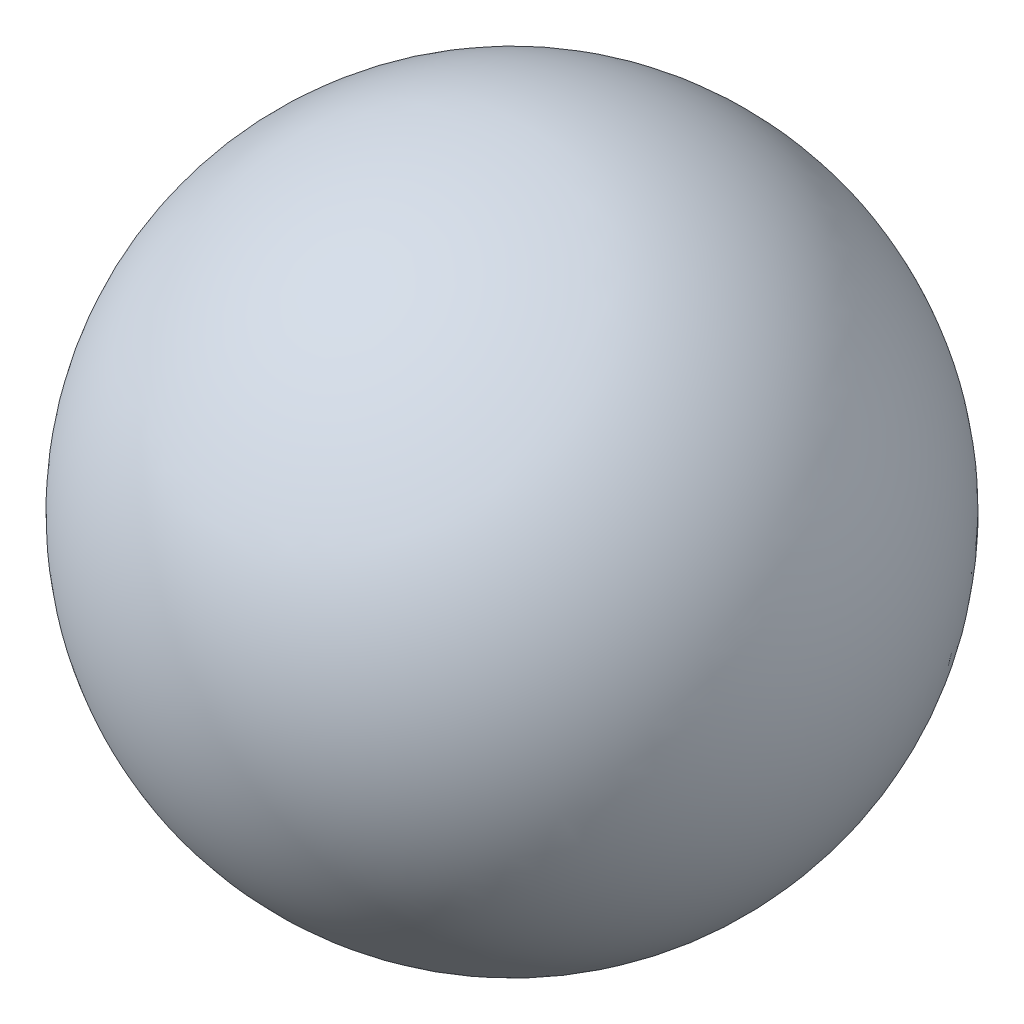
ISO-10303-21;
HEADER;
FILE_DESCRIPTION(('STEP AP214'),'2;1');
FILE_NAME('part.step','',(''),(''),'','','');
FILE_SCHEMA(('AUTOMOTIVE_DESIGN { 1 0 10303 214 1 1 1 1 }'));
ENDSEC;
DATA;
#1=APPLICATION_CONTEXT('core data for automotive mechanical design processes');
#2=APPLICATION_PROTOCOL_DEFINITION('international standard','automotive_design',2000,#1);
#3=PRODUCT_CONTEXT('',#1,'mechanical');
#4=PRODUCT('Part','Part','',(#3));
#5=PRODUCT_RELATED_PRODUCT_CATEGORY('part','',(#4));
#6=PRODUCT_DEFINITION_FORMATION('','',#4);
#7=PRODUCT_DEFINITION_CONTEXT('part definition',#1,'design');
#8=PRODUCT_DEFINITION('design','',#6,#7);
#9=PRODUCT_DEFINITION_SHAPE('','',#8);
#10=(LENGTH_UNIT() NAMED_UNIT(*) SI_UNIT(.MILLI.,.METRE.));
#11=(NAMED_UNIT(*) PLANE_ANGLE_UNIT() SI_UNIT($,.RADIAN.));
#12=(NAMED_UNIT(*) SI_UNIT($,.STERADIAN.) SOLID_ANGLE_UNIT());
#13=UNCERTAINTY_MEASURE_WITH_UNIT(LENGTH_MEASURE(1.E-05),#10,'distance_accuracy_value','');
#14=(GEOMETRIC_REPRESENTATION_CONTEXT(3) GLOBAL_UNCERTAINTY_ASSIGNED_CONTEXT((#13)) GLOBAL_UNIT_ASSIGNED_CONTEXT((#10,
#11,#12)) REPRESENTATION_CONTEXT('',''));
#15=CARTESIAN_POINT('',(0.,0.,0.));
#16=DIRECTION('',(0.,0.,1.));
#17=DIRECTION('',(1.,0.,0.));
#18=AXIS2_PLACEMENT_3D('',#15,#16,#17);
#19=CARTESIAN_POINT('',(0.,2.8,0.));
#20=DIRECTION('',(0.,1.,0.));
#21=DIRECTION('',(0.999203931432246,0.,-0.0398936512536098));
#22=AXIS2_PLACEMENT_3D('',#19,#20,#21);
#23=TOROIDAL_SURFACE('',#22,0.8,0.2);
#24=DIRECTION('',(0.0199507965661158,0.,0.999800963050335));
#25=VECTOR('',#24,1.);
#26=CARTESIAN_POINT('',(-0.8,3.,0.));
#27=LINE('',#26,#25);
#28=CARTESIAN_POINT('',(-0.800000000000041,3.,1.67526161996487E-11));
#29=VERTEX_POINT('',#28);
#30=CARTESIAN_POINT('',(-0.799363145145919,3.,0.031914921002895));
#31=VERTEX_POINT('',#30);
#32=EDGE_CURVE('P0_E93',#29,#31,#27,.T.);
#33=ORIENTED_EDGE('',*,*,#32,.T.);
#34=CARTESIAN_POINT('',(0.,3.,0.));
#35=DIRECTION('',(0.,1.,0.));
#36=DIRECTION('',(-0.999203931432245,0.,0.0398936512536145));
#37=AXIS2_PLACEMENT_3D('',#34,#35,#36);
#38=CIRCLE('',#37,0.800000000000204);
#39=CARTESIAN_POINT('',(0.800000000000021,3.,0.));
#40=VERTEX_POINT('',#39);
#41=EDGE_CURVE('P0_E88',#31,#40,#38,.T.);
#42=ORIENTED_EDGE('',*,*,#41,.T.);
#43=DIRECTION('',(-0.0199507965661158,0.,-0.999800963050335));
#44=VECTOR('',#43,1.);
#45=CARTESIAN_POINT('',(0.8,3.,0.));
#46=LINE('',#45,#44);
#47=CARTESIAN_POINT('',(0.799363145145919,3.,-0.031914921002895));
#48=VERTEX_POINT('',#47);
#49=EDGE_CURVE('P0_E96',#40,#48,#46,.T.);
#50=ORIENTED_EDGE('',*,*,#49,.T.);
#51=CARTESIAN_POINT('',(0.,3.,0.));
#52=DIRECTION('',(0.,1.,0.));
#53=DIRECTION('',(0.999203931432245,0.,-0.0398936512536098));
#54=AXIS2_PLACEMENT_3D('',#51,#52,#53);
#55=CIRCLE('',#54,0.800000000000102);
#56=EDGE_CURVE('P0_E101',#48,#29,#55,.T.);
#57=ORIENTED_EDGE('',*,*,#56,.T.);
#58=EDGE_LOOP('',(#33,#42,#50,#57));
#59=FACE_BOUND('',#58,.T.);
#60=CARTESIAN_POINT('',(0.,2.7999999999,0.));
#61=DIRECTION('',(0.,1.,0.));
#62=DIRECTION('',(0.,0.,1.));
#63=AXIS2_PLACEMENT_3D('',#60,#61,#62);
#64=CIRCLE('',#63,0.6);
#65=CARTESIAN_POINT('',(0.,2.7999999999,0.6));
#66=VERTEX_POINT('',#65);
#67=EDGE_CURVE('P0_E103',#66,#66,#64,.F.);
#68=ORIENTED_EDGE('',*,*,#67,.T.);
#69=EDGE_LOOP('',(#68));
#70=FACE_BOUND('',#69,.T.);
#71=ADVANCED_FACE('P0_F17',(#59,#70),#23,.T.);
#72=CARTESIAN_POINT('',(0.,-3.56791836294,0.));
#73=DIRECTION('',(0.,1.,0.));
#74=DIRECTION('',(0.,0.,1.));
#75=AXIS2_PLACEMENT_3D('',#72,#73,#74);
#76=CYLINDRICAL_SURFACE('',#75,0.6);
#77=ORIENTED_EDGE('',*,*,#67,.F.);
#78=EDGE_LOOP('',(#77));
#79=FACE_BOUND('',#78,.T.);
#80=CARTESIAN_POINT('',(0.,-2.71983479539,0.));
#81=DIRECTION('',(0.,1.,0.));
#82=DIRECTION('',(0.99996618489881,0.,0.00822368888753844));
#83=AXIS2_PLACEMENT_3D('',#80,#81,#82);
#84=CIRCLE('',#83,0.6);
#85=CARTESIAN_POINT('',(0.599979710939286,-2.71983479539,0.00493421333252306));
#86=VERTEX_POINT('',#85);
#87=EDGE_CURVE('P0_E222',#86,#86,#84,.T.);
#88=ORIENTED_EDGE('',*,*,#87,.F.);
#89=EDGE_LOOP('',(#88));
#90=FACE_BOUND('',#89,.T.);
#91=ADVANCED_FACE('P0_F284',(#79,#90),#76,.F.);
#92=CARTESIAN_POINT('',(0.,3.,0.));
#93=DIRECTION('',(0.,-1.,0.));
#94=DIRECTION('',(0.,0.,-1.));
#95=AXIS2_PLACEMENT_3D('',#92,#93,#94);
#96=PLANE('',#95);
#97=ORIENTED_EDGE('',*,*,#49,.F.);
#98=ORIENTED_EDGE('',*,*,#41,.F.);
#99=ORIENTED_EDGE('',*,*,#32,.F.);
#100=ORIENTED_EDGE('',*,*,#56,.F.);
#101=EDGE_LOOP('',(#97,#98,#99,#100));
#102=FACE_BOUND('',#101,.T.);
#103=DIRECTION('',(0.00460839338325163,0.,-0.999989381298834));
#104=VECTOR('',#103,1.);
#105=CARTESIAN_POINT('',(-2.30000000075,3.,0.));
#106=LINE('',#105,#104);
#107=CARTESIAN_POINT('',(-2.30000000057741,3.,0.));
#108=VERTEX_POINT('',#107);
#109=CARTESIAN_POINT('',(-2.29990230889264,3.,-0.0211983844652992));
#110=VERTEX_POINT('',#109);
#111=EDGE_CURVE('P0_E258',#108,#110,#106,.T.);
#112=ORIENTED_EDGE('',*,*,#111,.F.);
#113=CARTESIAN_POINT('',(2.29990230873,3.,0.0211983844638002));
#114=CARTESIAN_POINT('',(2.29965365827902,2.99999999999243,0.0481984414483055));
#115=CARTESIAN_POINT('',(2.29892962042185,2.99999999999973,0.075194103829194));
#116=CARTESIAN_POINT('',(2.29653259420025,2.99999999998972,0.129143261306098));
#117=CARTESIAN_POINT('',(2.29485960605591,2.99999999997242,0.156096756411892));
#118=CARTESIAN_POINT('',(2.29056650123263,2.99999999985886,0.209928241595834));
#119=CARTESIAN_POINT('',(2.28794638357615,2.9999999997626,0.236806231596024));
#120=CARTESIAN_POINT('',(2.28176232540654,2.9999999993833,0.290453476188574));
#121=CARTESIAN_POINT('',(2.27819838272631,2.99999999910026,0.317222730531122));
#122=CARTESIAN_POINT('',(2.27013106036576,2.99999999820043,0.370619403918533));
#123=CARTESIAN_POINT('',(2.26562767734097,2.99999999758363,0.397246822458105));
#124=CARTESIAN_POINT('',(2.25568704195322,2.99999999582632,0.450326900365794));
#125=CARTESIAN_POINT('',(2.25024978508525,2.9999999946858,0.476779558890231));
#126=CARTESIAN_POINT('',(2.23844811594067,2.99999999164913,0.52947740816921));
#127=CARTESIAN_POINT('',(2.23208369801965,2.99999998975298,0.555722597659689));
#128=CARTESIAN_POINT('',(2.21843556638811,2.99999998493087,0.60797305618346));
#129=CARTESIAN_POINT('',(2.21115184591924,2.99999998200491,0.633978323451431));
#130=CARTESIAN_POINT('',(2.19567410275477,2.99999997480694,0.685716780560432));
#131=CARTESIAN_POINT('',(2.1874800722166,2.99999997053492,0.711449968055328));
#132=CARTESIAN_POINT('',(2.17019182595279,2.9999999602861,0.762612444227607));
#133=CARTESIAN_POINT('',(2.16109760133429,2.99999995430927,0.788041729900016));
#134=CARTESIAN_POINT('',(2.14202019464909,2.99999994025114,0.83856495490608));
#135=CARTESIAN_POINT('',(2.13203700267729,2.99999993216981,0.863658890499599));
#136=CARTESIAN_POINT('',(2.11119398662619,2.99999991345621,0.91348038374579));
#137=CARTESIAN_POINT('',(2.10033415167169,2.99999990282391,0.938207936848794));
#138=CARTESIAN_POINT('',(2.07775125490729,2.99999987853686,0.987266075254033));
#139=CARTESIAN_POINT('',(2.06602818129812,2.99999986488206,1.01159665512464));
#140=CARTESIAN_POINT('',(2.04173328529858,2.99999983397249,1.05983078287461));
#141=CARTESIAN_POINT('',(2.02916145023491,2.99999981671766,1.0837343243709));
#142=CARTESIAN_POINT('',(2.00318452934511,2.99999977822653,1.13108470125854));
#143=CARTESIAN_POINT('',(1.98977943002491,2.99999975699016,1.15453152924569));
#144=CARTESIAN_POINT('',(1.9621526104086,2.99999970922331,1.20093987587613));
#145=CARTESIAN_POINT('',(1.94793087585677,2.99999968269273,1.22390138603781));
#146=CARTESIAN_POINT('',(1.92161215512938,2.99999963193932,1.26476867386163));
#147=CARTESIAN_POINT('',(1.9096589878986,2.99999960831592,1.282767254346));
#148=CARTESIAN_POINT('',(1.88525268970493,2.9999995517613,1.31842236508615));
#149=CARTESIAN_POINT('',(1.87279955085117,2.99999951882993,1.33607888993685));
#150=CARTESIAN_POINT('',(1.84001924485188,2.99999945514069,1.38117539899089));
#151=CARTESIAN_POINT('',(1.81931771903122,2.9999994367421,1.40834469508744));
#152=CARTESIAN_POINT('',(1.77669991576685,2.99999948967084,1.46170480695263));
#153=CARTESIAN_POINT('',(1.75478385028554,2.99999956098256,1.48789579212958));
#154=CARTESIAN_POINT('',(1.7135398933052,2.99999972214878,1.53497190941387));
#155=CARTESIAN_POINT('',(1.69439009058599,2.99999980692592,1.55601333530146));
#156=CARTESIAN_POINT('',(1.65530288373471,2.9999999447394,1.59734326070386));
#157=CARTESIAN_POINT('',(1.63536564692229,2.99999999778245,1.61763191841415));
#158=CARTESIAN_POINT('',(1.59477739284795,3.00000000221603,1.6574522679243));
#159=CARTESIAN_POINT('',(1.57412687659694,2.99999995367653,1.67698447139787));
#160=CARTESIAN_POINT('',(1.53216981232257,2.99999989301102,1.71531548974408));
#161=CARTESIAN_POINT('',(1.51086350805442,2.99999988087163,1.7341145713647));
#162=CARTESIAN_POINT('',(1.46327545757791,2.99999995675938,1.77461508951691));
#163=CARTESIAN_POINT('',(1.43684944211923,3.00000006526287,1.79614690062829));
#164=CARTESIAN_POINT('',(1.38316116246178,2.99999993167704,1.83813381174664));
#165=CARTESIAN_POINT('',(1.35589910067706,2.99999968967193,1.85858916916551));
#166=CARTESIAN_POINT('',(1.32119201373494,2.99999937834838,1.88330319459464));
#167=CARTESIAN_POINT('',(1.31420753421248,2.99999931553818,1.8882112045222));
#168=CARTESIAN_POINT('',(1.29503755752484,2.99999921400903,1.90149273932856));
#169=CARTESIAN_POINT('',(1.28278745731379,2.99999922658218,1.90977312492334));
#170=CARTESIAN_POINT('',(1.24771793504172,2.99999927782626,1.93298160074667));
#171=CARTESIAN_POINT('',(1.22470668941478,2.99999932956863,1.94762012670238));
#172=CARTESIAN_POINT('',(1.16983956551666,2.99999948165541,1.98114757007312));
#173=CARTESIAN_POINT('',(1.13776603484924,2.99999959276709,1.99968239338425));
#174=CARTESIAN_POINT('',(1.08986639194035,2.9999997314347,2.02583627662207));
#175=CARTESIAN_POINT('',(1.07437098113798,2.99999977219356,2.03406748045581));
#176=CARTESIAN_POINT('',(1.04180657458256,2.99999985060723,2.05088648430093));
#177=CARTESIAN_POINT('',(1.02472025179088,2.9999998876631,2.05944083803546));
#178=CARTESIAN_POINT('',(0.97965012874521,2.9999999581791,2.08131722973934));
#179=CARTESIAN_POINT('',(0.951499211737364,2.99999997506308,2.09429483380624));
#180=CARTESIAN_POINT('',(0.87277838539069,3.0000000044706,2.12871390028809));
#181=CARTESIAN_POINT('',(0.821676551398348,3.00000000356813,2.14895609410708));
#182=CARTESIAN_POINT('',(0.737035611820098,2.99999997893655,2.17908556769545));
#183=CARTESIAN_POINT('',(0.703877855734529,2.99999996363996,2.19005926901736));
#184=CARTESIAN_POINT('',(0.651668083361263,2.99999991086288,2.20603519449102));
#185=CARTESIAN_POINT('',(0.632773514772651,2.99999988597292,2.21155385830844));
#186=CARTESIAN_POINT('',(0.589656145879149,2.99999983483319,2.22353844880046));
#187=CARTESIAN_POINT('',(0.565390303754433,2.99999981007548,2.22985028217511));
#188=CARTESIAN_POINT('',(0.516160145116104,2.99999977202852,2.24179020598926));
#189=CARTESIAN_POINT('',(0.49119175519926,2.99999975898677,2.24740147757466));
#190=CARTESIAN_POINT('',(0.440572833880195,2.99999974885441,2.25788299882702));
#191=CARTESIAN_POINT('',(0.41491872035391,2.99999975209179,2.26273596351633));
#192=CARTESIAN_POINT('',(0.362948681009571,2.99999977410386,2.27164238708949));
#193=CARTESIAN_POINT('',(0.336629713430216,2.99999979318511,2.27567810009723));
#194=CARTESIAN_POINT('',(0.286067046009004,2.99999983622876,2.28253017428332));
#195=CARTESIAN_POINT('',(0.261833311184953,2.99999985965141,2.28542015384877));
#196=CARTESIAN_POINT('',(0.212868356367881,2.99999991454603,2.29044790792652));
#197=CARTESIAN_POINT('',(0.18813573061199,2.99999994614913,2.29257193614312));
#198=CARTESIAN_POINT('',(0.138559109979283,2.99999997046422,2.29607130714756));
#199=CARTESIAN_POINT('',(0.113714989983906,2.99999996308454,2.29744487680595));
#200=CARTESIAN_POINT('',(0.066678627487916,2.99999995096579,2.29927991458161));
#201=CARTESIAN_POINT('',(0.044489571551026,2.99999994602768,2.29982382467464));
#202=CARTESIAN_POINT('',(-0.00669864523102134,2.99999993068504,2.30034008903715));
#203=CARTESIAN_POINT('',(-0.0357004870403893,2.99999991906892,2.30008614847406));
#204=CARTESIAN_POINT('',(-0.0853425554180745,2.99999989626507,2.29871308769052));
#205=CARTESIAN_POINT('',(-0.105990784521057,2.99999988591341,2.2978635477507));
#206=CARTESIAN_POINT('',(-0.149703064424392,2.99999986159487,2.2954752889071));
#207=CARTESIAN_POINT('',(-0.172763366296768,2.99999984734491,2.29386681674969));
#208=CARTESIAN_POINT('',(-0.221265650568142,2.9999998150285,2.28974843811066));
#209=CARTESIAN_POINT('',(-0.246701053301937,2.99999979671763,2.28716106753381));
#210=CARTESIAN_POINT('',(-0.299904849789806,2.99999975272806,2.28085291033762));
#211=CARTESIAN_POINT('',(-0.327663251667034,2.99999972651147,2.27704727450358));
#212=CARTESIAN_POINT('',(-0.376049472415062,2.99999968453338,2.26950676965432));
#213=CARTESIAN_POINT('',(-0.396712431047593,2.99999966780166,2.26599547047929));
#214=CARTESIAN_POINT('',(-0.437933001064102,2.99999964713193,2.25840265125293));
#215=CARTESIAN_POINT('',(-0.458490614443118,2.99999964319369,2.25432114204197));
#216=CARTESIAN_POINT('',(-0.504608871470486,2.99999964713338,2.24450084720197));
#217=CARTESIAN_POINT('',(-0.530135744628684,2.99999965821067,2.23860281334211));
#218=CARTESIAN_POINT('',(-0.580969644899699,2.99999969649517,2.22593025098538));
#219=CARTESIAN_POINT('',(-0.606276682096654,2.99999972370163,2.21915576292149));
#220=CARTESIAN_POINT('',(-0.656638931006717,2.99999978721438,2.20473384566026));
#221=CARTESIAN_POINT('',(-0.681694157374111,2.99999982352013,2.19708646758511));
#222=CARTESIAN_POINT('',(-0.731529330919957,2.99999989471985,2.18094590918829));
#223=CARTESIAN_POINT('',(-0.756309297505494,2.99999992961393,2.17245278892149));
#224=CARTESIAN_POINT('',(-0.805538933133537,2.99999998176202,2.15456464388096));
#225=CARTESIAN_POINT('',(-0.829988629544142,2.9999999990175,2.14516969436754));
#226=CARTESIAN_POINT('',(-0.856760019489312,3.00000000009912,2.1344728768889));
#227=CARTESIAN_POINT('',(-0.859211954748865,3.00000000003262,2.13348936945827));
#228=CARTESIAN_POINT('',(-0.867952512786053,2.99999999961895,2.12996723586601));
#229=CARTESIAN_POINT('',(-0.874232374722617,2.99999999899524,2.12740678991619));
#230=CARTESIAN_POINT('',(-0.909439093981634,2.99999999238598,2.11287036495946));
#231=CARTESIAN_POINT('',(-0.93813451329843,2.99999997516688,2.10033117987625));
#232=CARTESIAN_POINT('',(-1.01488175894971,2.9999998852926,2.06491609243777));
#233=CARTESIAN_POINT('',(-1.06243511667755,2.99999978228882,2.04094425072132));
#234=CARTESIAN_POINT('',(-1.13087831252305,2.99999959792267,2.00339311082381));
#235=CARTESIAN_POINT('',(-1.1524747085733,2.99999953427193,1.99108201775186));
#236=CARTESIAN_POINT('',(-1.19472150732572,2.99999943986195,1.96606412284783));
#237=CARTESIAN_POINT('',(-1.21538210103342,2.99999940832928,1.95337459995163));
#238=CARTESIAN_POINT('',(-1.25460793987592,2.99999937929494,1.92840522347023));
#239=CARTESIAN_POINT('',(-1.27320612606307,2.99999937921573,1.91617704406965));
#240=CARTESIAN_POINT('',(-1.30957972283294,2.99999941801412,1.89147880205929));
#241=CARTESIAN_POINT('',(-1.32736413083183,2.99999945593864,1.87902197710145));
#242=CARTESIAN_POINT('',(-1.3714930103406,2.9999995517196,1.84716767359204));
#243=CARTESIAN_POINT('',(-1.39760851862133,2.99999960993803,1.82745176711007));
#244=CARTESIAN_POINT('',(-1.44868779119327,2.99999969854647,1.78716311946115));
#245=CARTESIAN_POINT('',(-1.47366128655702,2.99999972924592,1.76660269713527));
#246=CARTESIAN_POINT('',(-1.52622314968619,2.99999978668238,1.72143974365909));
#247=CARTESIAN_POINT('',(-1.55367587617993,2.99999981222812,1.69667917897729));
#248=CARTESIAN_POINT('',(-1.61071367983034,2.99999985717235,1.64269077841985));
#249=CARTESIAN_POINT('',(-1.64013678763194,2.99999987540443,1.61329125893389));
#250=CARTESIAN_POINT('',(-1.68423384338173,2.99999989895462,1.5667766954135));
#251=CARTESIAN_POINT('',(-1.69948725956654,2.99999990636173,1.55020680849842));
#252=CARTESIAN_POINT('',(-1.73027123173569,2.99999992002508,1.51576560097922));
#253=CARTESIAN_POINT('',(-1.74577592030358,2.99999992620287,1.49787110583494));
#254=CARTESIAN_POINT('',(-1.77696823375217,2.99999993757144,1.46072859540942));
#255=CARTESIAN_POINT('',(-1.7926279218102,2.9999999426994,1.44145712550018));
#256=CARTESIAN_POINT('',(-1.82402908453223,2.99999995207329,1.40151012948531));
#257=CARTESIAN_POINT('',(-1.83974051866328,2.99999995626712,1.38081097983055));
#258=CARTESIAN_POINT('',(-1.87113578756802,2.9999999638866,1.33796147042166));
#259=CARTESIAN_POINT('',(-1.88678739258196,2.99999996726985,1.31578749097606));
#260=CARTESIAN_POINT('',(-1.9179455304358,2.99999997337096,1.26994520814927));
#261=CARTESIAN_POINT('',(-1.93341757967589,2.99999997605439,1.24625346029268));
#262=CARTESIAN_POINT('',(-1.96409086091745,2.99999998085293,1.1973376484146));
#263=CARTESIAN_POINT('',(-1.97925529384471,2.99999998294038,1.17209050264475));
#264=CARTESIAN_POINT('',(-2.00917933069357,2.99999998663652,1.12003206734694));
#265=CARTESIAN_POINT('',(-2.02389976831063,2.99999998822323,1.09319825778579));
#266=CARTESIAN_POINT('',(-2.05279359678834,2.99999999100017,1.03794196585138));
#267=CARTESIAN_POINT('',(-2.06692541245352,2.9999999921732,1.00949773688875));
#268=CARTESIAN_POINT('',(-2.09449174402398,2.9999999941976,0.951004558289831));
#269=CARTESIAN_POINT('',(-2.10788224644029,2.99999999503572,0.92093485943411));
#270=CARTESIAN_POINT('',(-2.13380794456645,2.99999999645751,0.859184410759735));
#271=CARTESIAN_POINT('',(-2.14629667307685,2.99999999703122,0.827484144961176));
#272=CARTESIAN_POINT('',(-2.17025347193828,2.99999999798371,0.762477229215846));
#273=CARTESIAN_POINT('',(-2.18167262191889,2.99999999835522,0.729152543781272));
#274=CARTESIAN_POINT('',(-2.20331811384134,2.99999999895503,0.66091376658254));
#275=CARTESIAN_POINT('',(-2.21349310060013,2.99999999917824,0.625983377720404));
#276=CARTESIAN_POINT('',(-2.23247202867931,2.99999999952534,0.554563819846123));
#277=CARTESIAN_POINT('',(-2.24122221858352,2.99999999964585,0.518060359725365));
#278=CARTESIAN_POINT('',(-2.25716805873558,2.99999999982358,0.443540277779504));
#279=CARTESIAN_POINT('',(-2.26430762070888,2.99999999987873,0.40551164684745));
#280=CARTESIAN_POINT('',(-2.27684464264243,2.99999999995363,0.328003181197886));
#281=CARTESIAN_POINT('',(-2.28218376521815,2.99999999997227,0.28851390264527));
#282=CARTESIAN_POINT('',(-2.29092895350253,2.99999999999471,0.20816372114048));
#283=CARTESIAN_POINT('',(-2.29427452986338,2.99999999999806,0.167296227214109));
#284=CARTESIAN_POINT('',(-2.2988418920316,2.99999999999988,0.0842882067110418));
#285=CARTESIAN_POINT('',(-2.30000122447754,2.99999999999821,0.0421442363894573));
#286=CARTESIAN_POINT('',(-2.30000000075,3.,0.));
#287=B_SPLINE_CURVE_WITH_KNOTS('',3,(#113,#114,#115,#116,#117,#118,#119,#120,#121,#122,#123,
#124,#125,#126,#127,#128,#129,#130,#131,#132,#133,#134,#135,#136,#137,#138,#139,#140,#141,#142,
#143,#144,#145,#146,#147,#148,#149,#150,#151,#152,#153,#154,#155,#156,#157,#158,#159,#160,#161,
#162,#163,#164,#165,#166,#167,#168,#169,#170,#171,#172,#173,#174,#175,#176,#177,#178,#179,#180,
#181,#182,#183,#184,#185,#186,#187,#188,#189,#190,#191,#192,#193,#194,#195,#196,#197,#198,#199,
#200,#201,#202,#203,#204,#205,#206,#207,#208,#209,#210,#211,#212,#213,#214,#215,#216,#217,#218,
#219,#220,#221,#222,#223,#224,#225,#226,#227,#228,#229,#230,#231,#232,#233,#234,#235,#236,#237,
#238,#239,#240,#241,#242,#243,#244,#245,#246,#247,#248,#249,#250,#251,#252,#253,#254,#255,#256,
#257,#258,#259,#260,#261,#262,#263,#264,#265,#266,#267,#268,#269,#270,#271,#272,#273,#274,#275,
#276,#277,#278,#279,#280,#281,#282,#283,#284,#285,#286),.UNSPECIFIED.,.F.,.F.,(4,2,2,2,2,2,2,2,
2,2,2,2,2,2,2,2,2,2,2,2,2,2,2,2,2,2,2,2,2,2,2,2,2,2,2,2,2,2,2,2,2,2,2,2,2,2,2,2,2,2,2,2,2,2,2,2,
2,2,2,2,2,2,2,2,2,2,2,2,2,2,2,2,2,2,2,2,2,2,2,2,2,2,2,2,2,2,4),(0.,0.0809994061570567,
0.161998793528017,0.242998264498447,0.32399792145344,0.404997866777636,0.485998202855204,
0.566999032069846,0.648000456804785,0.729002579442766,0.81000550236604,0.891009327956346,
0.97201415859491,1.05302009666241,1.13402724453898,1.21503570460413,1.29604557923679,
1.36085576956194,1.42566698316598,1.52810162702746,1.63051844987154,1.71585123234269,
1.80116597922652,1.88642197284414,1.97164665081779,2.07388174934623,2.1760922883021,
2.2017011537199,2.2460561679217,2.32785776567149,2.43893911214967,2.49157346895452,
2.54889152238085,2.64186521914721,2.80660595593143,2.91135260714698,2.97039866094117,
3.04560410217858,3.12236317714836,3.20067490385411,3.2805382375544,3.35374168732226,
3.42820022980721,3.5028339450496,3.56941251477955,3.65639865464195,3.71838906671079,
3.78772724861126,3.86441340356399,3.94844776553465,4.01131775545162,4.07418655029882,
4.15276869654774,4.23134721890124,4.3099211415371,4.38848948873047,4.46705128485496,
4.47497680205347,4.49532191392121,4.58924470196071,4.74885563286187,4.82342242998428,
4.89614786885747,4.96291231488935,5.02804329160129,5.12617814071607,5.22319510555188,
5.33406157182372,5.45877613119464,5.52633324441261,5.59735301575165,5.67183538074655,
5.74978027879022,5.83118765313548,5.91605745089628,6.00438962304884,6.0961841244324,
6.19144091374988,6.29015995356842,6.39234121031975,6.49798465430048,6.60709025967236,
6.71965800446243,6.83568787056309,6.95517984373221,7.07813391359313,7.20455007363465),.UNSPECIFIED.);
#288=CARTESIAN_POINT('',(2.29990230889264,3.,0.0211983844652992));
#289=VERTEX_POINT('',#288);
#290=EDGE_CURVE('P0_E260',#289,#108,#287,.T.);
#291=ORIENTED_EDGE('',*,*,#290,.F.);
#292=DIRECTION('',(-0.00460839338325141,0.,0.999989381298834));
#293=VECTOR('',#292,1.);
#294=CARTESIAN_POINT('',(2.30000000075,3.,0.));
#295=LINE('',#294,#293);
#296=CARTESIAN_POINT('',(2.30000000052862,3.,0.));
#297=VERTEX_POINT('',#296);
#298=EDGE_CURVE('P0_E229',#297,#289,#295,.T.);
#299=ORIENTED_EDGE('',*,*,#298,.F.);
#300=CARTESIAN_POINT('',(0.,3.,0.));
#301=DIRECTION('',(0.,-1.,0.));
#302=DIRECTION('',(-0.99995752542085,0.,-0.0092166888962542));
#303=AXIS2_PLACEMENT_3D('',#300,#301,#302);
#304=CIRCLE('',#303,2.30000000026206);
#305=EDGE_CURVE('P0_E184',#110,#297,#304,.T.);
#306=ORIENTED_EDGE('',*,*,#305,.F.);
#307=EDGE_LOOP('',(#112,#291,#299,#306));
#308=FACE_BOUND('',#307,.T.);
#309=ADVANCED_FACE('P0_F91',(#102,#308),#96,.F.);
#310=CARTESIAN_POINT('',(0.,-2.71983479539,0.));
#311=DIRECTION('',(0.,1.,0.));
#312=DIRECTION('',(-0.99996618489881,0.,-0.00822368888753844));
#313=AXIS2_PLACEMENT_3D('',#310,#311,#312);
#314=TOROIDAL_SURFACE('',#313,0.8,0.2);
#315=ORIENTED_EDGE('',*,*,#87,.T.);
#316=EDGE_LOOP('',(#315));
#317=FACE_BOUND('',#316,.T.);
#318=CARTESIAN_POINT('',(0.82536891468476,-2.91821574522812,0.00678778656603733));
#319=CARTESIAN_POINT('',(0.825370013258794,-2.91821590234996,0.00650496194349231));
#320=CARTESIAN_POINT('',(0.825371114254997,-2.9182160405516,0.00622213731984469));
#321=CARTESIAN_POINT('',(0.825373321091595,-2.91821627911449,0.00565648811445028));
#322=CARTESIAN_POINT('',(0.825374426931989,-2.91821637947574,0.00537366353270349));
#323=CARTESIAN_POINT('',(0.825376643456971,-2.91821654235784,0.00480801441625527));
#324=CARTESIAN_POINT('',(0.825377754141558,-2.9182166048787,0.00452518988155383));
#325=CARTESIAN_POINT('',(0.82537998035492,-2.91821669208004,0.00395954086434331));
#326=CARTESIAN_POINT('',(0.825381095883695,-2.91821671676053,0.00367671638183421));
#327=CARTESIAN_POINT('',(0.825383331785432,-2.91821672828113,0.00311106747415329));
#328=CARTESIAN_POINT('',(0.825384452158394,-2.91821671512125,0.00282824304898146));
#329=CARTESIAN_POINT('',(0.825386697748506,-2.91821665096114,0.00226259426112143));
#330=CARTESIAN_POINT('',(0.825387822965655,-2.91821659996092,0.00197976989843323));
#331=CARTESIAN_POINT('',(0.825390078244136,-2.91821646012012,0.00141412124068679));
#332=CARTESIAN_POINT('',(0.825391208305467,-2.91821637127956,0.00113129694562854));
#333=CARTESIAN_POINT('',(0.825393473272313,-2.91821615575811,0.000565648428286846));
#334=CARTESIAN_POINT('',(0.825394608177827,-2.91821602907723,0.00028282420600339));
#335=CARTESIAN_POINT('',(0.825395745505512,-2.91821588347618,3.20057693167577E-12));
#336=B_SPLINE_CURVE_WITH_KNOTS('',3,(#318,#319,#320,#321,#322,#323,#324,#325,#326,#327,#328,
#329,#330,#331,#332,#333,#334,#335),.UNSPECIFIED.,.F.,.F.,(4,2,2,2,2,2,2,2,4),(0.,
0.000848480398676166,0.00169696068047083,0.00254544084538787,0.00339392089342372,
0.00424240082458103,0.00509088063885813,0.0059393603362534,0.00678783991676978),.UNSPECIFIED.);
#337=CARTESIAN_POINT('',(0.825368734598823,-2.91821576827083,0.00678779850911423));
#338=VERTEX_POINT('',#337);
#339=CARTESIAN_POINT('',(0.825396105537268,-2.91821583738569,3.73312844111181E-12));
#340=VERTEX_POINT('',#339);
#341=EDGE_CURVE('P0_E255',#338,#340,#336,.T.);
#342=ORIENTED_EDGE('',*,*,#341,.F.);
#343=CARTESIAN_POINT('',(0.,-2.91821574523088,0.));
#344=DIRECTION('',(0.,1.,0.));
#345=DIRECTION('',(-0.99996618489881,0.,-0.00822368888753844));
#346=AXIS2_PLACEMENT_3D('',#343,#344,#345);
#347=CIRCLE('',#346,0.825396825396698);
#348=CARTESIAN_POINT('',(-0.825396825396003,-2.91821574522937,-1.82649618088913E-12));
#349=VERTEX_POINT('',#348);
#350=EDGE_CURVE('P0_E183',#349,#338,#347,.T.);
#351=ORIENTED_EDGE('',*,*,#350,.F.);
#352=CARTESIAN_POINT('',(-0.825368918045518,-2.91821574561378,-0.00678701155685074));
#353=CARTESIAN_POINT('',(-0.825370099599968,-2.91821589204449,-0.00650421951142593));
#354=CARTESIAN_POINT('',(-0.825371278810893,-2.91821602016935,-0.00622142744673063));
#355=CARTESIAN_POINT('',(-0.825373632545696,-2.9182162398074,-0.00565584328361615));
#356=CARTESIAN_POINT('',(-0.825374807069574,-2.91821633132058,-0.00537305118519696));
#357=CARTESIAN_POINT('',(-0.825377151430286,-2.91821647773525,-0.00480746695945287));
#358=CARTESIAN_POINT('',(-0.825378321267119,-2.91821653263674,-0.00452467483212797));
#359=CARTESIAN_POINT('',(-0.825380656253737,-2.91821660582801,-0.0039590905533887));
#360=CARTESIAN_POINT('',(-0.825381821403521,-2.91821662411781,-0.00367629840197433));
#361=CARTESIAN_POINT('',(-0.825384147016042,-2.91821662408569,-0.00311071407987529));
#362=CARTESIAN_POINT('',(-0.825385307478779,-2.91821660576378,-0.00282792190919061));
#363=CARTESIAN_POINT('',(-0.825387623717207,-2.91821653250826,-0.00226233755336815));
#364=CARTESIAN_POINT('',(-0.825388779492897,-2.91821647757465,-0.00197954536823037));
#365=CARTESIAN_POINT('',(-0.825391086357229,-2.91821633109573,-0.00141396098831941));
#366=CARTESIAN_POINT('',(-0.825392237445871,-2.91821623955041,-0.00113116879354622));
#367=CARTESIAN_POINT('',(-0.825394534936106,-2.91821601984808,-0.000565584399182161));
#368=CARTESIAN_POINT('',(-0.8253956813377,-2.91821589169107,-0.000282792199591278));
#369=CARTESIAN_POINT('',(-0.82539682539577,-2.9182157452282,0.));
#370=B_SPLINE_CURVE_WITH_KNOTS('',3,(#352,#353,#354,#355,#356,#357,#358,#359,#360,#361,#362,
#363,#364,#365,#366,#367,#368,#369),.UNSPECIFIED.,.F.,.F.,(4,2,2,2,2,2,2,2,4),(0.,
0.000848383654483034,0.00169676730896773,0.00254515096345245,0.00339353461794125,
0.00424191827242956,0.00509030192691859,0.00593868558140811,0.00678706923589787),.UNSPECIFIED.);
#371=CARTESIAN_POINT('',(-0.825368915762633,-2.91821574534937,-0.00678754165338906));
#372=VERTEX_POINT('',#371);
#373=EDGE_CURVE('P0_E251',#372,#349,#370,.T.);
#374=ORIENTED_EDGE('',*,*,#373,.F.);
#375=CARTESIAN_POINT('',(0.,-2.91821574520475,0.));
#376=DIRECTION('',(0.,1.,0.));
#377=DIRECTION('',(0.99996618489881,0.,0.00822368888753844));
#378=AXIS2_PLACEMENT_3D('',#375,#376,#377);
#379=CIRCLE('',#378,0.825396825600787);
#380=EDGE_CURVE('P0_E176',#340,#372,#379,.T.);
#381=ORIENTED_EDGE('',*,*,#380,.F.);
#382=EDGE_LOOP('',(#342,#351,#374,#381));
#383=FACE_BOUND('',#382,.T.);
#384=ADVANCED_FACE('P0_F196',(#317,#383),#314,.T.);
#385=CARTESIAN_POINT('',(0.,2.8,0.));
#386=DIRECTION('',(0.,-1.,0.));
#387=DIRECTION('',(-0.99995414071596,0.,-0.00957687135784962));
#388=AXIS2_PLACEMENT_3D('',#385,#386,#387);
#389=TOROIDAL_SURFACE('',#388,2.3,0.2);
#390=ORIENTED_EDGE('',*,*,#298,.T.);
#391=ORIENTED_EDGE('',*,*,#290,.T.);
#392=ORIENTED_EDGE('',*,*,#111,.T.);
#393=ORIENTED_EDGE('',*,*,#305,.T.);
#394=EDGE_LOOP('',(#390,#391,#392,#393));
#395=FACE_BOUND('',#394,.T.);
#396=CARTESIAN_POINT('',(0.,2.8,0.));
#397=DIRECTION('',(0.,-1.,0.));
#398=DIRECTION('',(0.,0.,-1.));
#399=AXIS2_PLACEMENT_3D('',#396,#397,#398);
#400=CIRCLE('',#399,2.5);
#401=CARTESIAN_POINT('',(0.,2.8,-2.5));
#402=VERTEX_POINT('',#401);
#403=EDGE_CURVE('P0_E187',#402,#402,#400,.T.);
#404=ORIENTED_EDGE('',*,*,#403,.F.);
#405=EDGE_LOOP('',(#404));
#406=FACE_BOUND('',#405,.T.);
#407=ADVANCED_FACE('P0_F192',(#395,#406),#389,.T.);
#408=CARTESIAN_POINT('',(0.,3.5291651246,0.));
#409=DIRECTION('',(0.991904749204328,-0.126984126984042,0.));
#410=DIRECTION('',(0.,0.,1.));
#411=AXIS2_PLACEMENT_3D('',#408,#409,#410);
#412=SPHERICAL_SURFACE('',#411,6.5);
#413=CARTESIAN_POINT('',(3.146825396829,-2.15832025312819,0.));
#414=CARTESIAN_POINT('',(3.14682394877864,-2.15832105431912,0.000653806204840195));
#415=CARTESIAN_POINT('',(3.14682251626136,-2.15832173417736,0.00130761259276588));
#416=CARTESIAN_POINT('',(3.14681968229212,-2.15832285122884,0.00261522600941549));
#417=CARTESIAN_POINT('',(3.14681828084019,-2.15832328842194,0.00326903303813956));
#418=CARTESIAN_POINT('',(3.14681550900171,-2.15832392014276,0.00457664764484338));
#419=CARTESIAN_POINT('',(3.14681413861517,-2.15832411467035,0.00523045522282324));
#420=CARTESIAN_POINT('',(3.14681142890754,-2.15832426105984,0.00653807083649422));
#421=CARTESIAN_POINT('',(3.14681008958646,-2.1583242129216,0.00719187887218539));
#422=CARTESIAN_POINT('',(3.14680744200975,-2.15832387397914,0.00849949530973606));
#423=CARTESIAN_POINT('',(3.14680613375414,-2.15832358317479,0.00915330371159556));
#424=CARTESIAN_POINT('',(3.14680354830842,-2.15832275889984,0.0104609207899385));
#425=CARTESIAN_POINT('',(3.14680227111833,-2.15832222542911,0.0111147294664219));
#426=CARTESIAN_POINT('',(3.14679974780367,-2.15832091582119,0.0124223470024682));
#427=CARTESIAN_POINT('',(3.14679850167912,-2.15832013968387,0.013076155862031));
#428=CARTESIAN_POINT('',(3.14679604049556,-2.15831834474258,0.0143837736726928));
#429=CARTESIAN_POINT('',(3.14679482543658,-2.15831732593848,0.0150375826237916));
#430=CARTESIAN_POINT('',(3.14679362591071,-2.15831618580129,0.0156913913918032));
#431=B_SPLINE_CURVE_WITH_KNOTS('',3,(#413,#414,#415,#416,#417,#418,#419,#420,#421,#422,#423,
#424,#425,#426,#427,#428,#429,#430),.UNSPECIFIED.,.F.,.F.,(4,2,2,2,2,2,2,2,4),(0.,
0.00196142488647775,0.00392285087146255,0.00588427795495601,0.00784570613695448,
0.00980713541745939,0.0117685657964682,0.0137299972739787,0.0156914298499922),.UNSPECIFIED.);
#432=CARTESIAN_POINT('',(3.14682907237033,-2.15831821939196,0.));
#433=VERTEX_POINT('',#432);
#434=CARTESIAN_POINT('',(3.14679004916227,-2.15831816473489,0.0156913826332013));
#435=VERTEX_POINT('',#434);
#436=EDGE_CURVE('P0_E177',#433,#435,#431,.T.);
#437=ORIENTED_EDGE('',*,*,#436,.T.);
#438=CARTESIAN_POINT('',(0.,-2.15832014375541,0.));
#439=DIRECTION('',(0.,-1.,0.));
#440=DIRECTION('',(0.999987567772119,0.,0.00498641165595059));
#441=AXIS2_PLACEMENT_3D('',#438,#439,#440);
#442=CIRCLE('',#441,3.14682559451299);
#443=CARTESIAN_POINT('',(-0.728114598753103,-2.15831996208457,3.06143144947538));
#444=VERTEX_POINT('',#443);
#445=EDGE_CURVE('P0_E239',#444,#435,#442,.F.);
#446=ORIENTED_EDGE('',*,*,#445,.F.);
#447=CARTESIAN_POINT('',(-8.01296271113171E-13,3.5291651246001,0.));
#448=DIRECTION('',(0.991904749204328,-0.126984126984042,0.));
#449=DIRECTION('',(0.,0.,1.));
#450=AXIS2_PLACEMENT_3D('',#447,#448,#449);
#451=CIRCLE('',#450,6.5);
#452=EDGE_CURVE('P0_E181',#444,#349,#451,.T.);
#453=ORIENTED_EDGE('',*,*,#452,.T.);
#454=ORIENTED_EDGE('',*,*,#350,.T.);
#455=ORIENTED_EDGE('',*,*,#341,.T.);
#456=CARTESIAN_POINT('',(0.,3.5291651246,0.));
#457=DIRECTION('',(0.,0.,-1.));
#458=DIRECTION('',(0.991904749204328,-0.126984126984042,0.));
#459=AXIS2_PLACEMENT_3D('',#456,#457,#458);
#460=CIRCLE('',#459,6.5);
#461=EDGE_CURVE('P0_E168',#433,#340,#460,.T.);
#462=ORIENTED_EDGE('',*,*,#461,.F.);
#463=EDGE_LOOP('',(#437,#446,#453,#454,#455,#462));
#464=FACE_BOUND('',#463,.T.);
#465=ADVANCED_FACE('P0_F153',(#464),#412,.T.);
#466=CARTESIAN_POINT('',(0.,3.5291651246,0.));
#467=DIRECTION('',(-0.991904749204328,0.126984126984042,0.));
#468=DIRECTION('',(0.,0.,-1.));
#469=AXIS2_PLACEMENT_3D('',#466,#467,#468);
#470=SPHERICAL_SURFACE('',#469,6.5);
#471=CARTESIAN_POINT('',(-0.72811463601245,-2.15832025313352,-3.06143089991189));
#472=CARTESIAN_POINT('',(-0.759932938133538,-2.15832025308864,-3.05386358577745));
#473=CARTESIAN_POINT('',(-0.791632933057415,-2.15832082781752,-3.0457988787862));
#474=CARTESIAN_POINT('',(-0.854765262761035,-2.15832312654425,-3.02868339114362));
#475=CARTESIAN_POINT('',(-0.886197600161339,-2.15832485053084,-3.01963262015856));
#476=CARTESIAN_POINT('',(-0.948763825604034,-2.15832944746734,-3.00055368024449));
#477=CARTESIAN_POINT('',(-0.97989771715702,-2.15833232040372,-2.99052552282794));
#478=CARTESIAN_POINT('',(-1.04183662555767,-2.15833921477495,-2.96950170224493));
#479=CARTESIAN_POINT('',(-1.07264164692247,-2.15834323619399,-2.95850605238649));
#480=CARTESIAN_POINT('',(-1.13389269582187,-2.15835242637983,-2.93555802020891));
#481=CARTESIAN_POINT('',(-1.16433872899548,-2.15835759512858,-2.92360565294098));
#482=CARTESIAN_POINT('',(-1.22484203892906,-2.15836908039332,-2.89875591423814));
#483=CARTESIAN_POINT('',(-1.25489932256263,-2.15837539688899,-2.88585855953882));
#484=CARTESIAN_POINT('',(-1.3145957616163,-2.15838917113956,-2.85913150491362));
#485=CARTESIAN_POINT('',(-1.34423492525466,-2.158396628872,-2.84530182334385));
#486=CARTESIAN_POINT('',(-1.40306613178031,-2.15841270389386,-2.81672365843185));
#487=CARTESIAN_POINT('',(-1.43225818433864,-2.15842132115816,-2.801975194998));
#488=CARTESIAN_POINT('',(-1.49016674074816,-2.15843963991474,-2.77157402806326));
#489=CARTESIAN_POINT('',(-1.51888325582477,-2.15844934138138,-2.7559213459464));
#490=CARTESIAN_POINT('',(-1.57581231518433,-2.1584701015686,-2.72372675224089));
#491=CARTESIAN_POINT('',(-1.60402487235985,-2.1584811602544,-2.707184863444));
#492=CARTESIAN_POINT('',(-1.65991981755275,-2.15850360682281,-2.6732293736027));
#493=CARTESIAN_POINT('',(-1.68760222018151,-2.15851499469631,-2.65581579663047));
#494=CARTESIAN_POINT('',(-1.74240473485601,-2.15854192603859,-2.62012920184044));
#495=CARTESIAN_POINT('',(-1.76952486351159,-2.15855746938442,-2.60185620946243));
#496=CARTESIAN_POINT('',(-1.84581698617522,-2.15858725155871,-2.54873569739689));
#497=CARTESIAN_POINT('',(-1.89430724846144,-2.15858934648715,-2.51290067026747));
#498=CARTESIAN_POINT('',(-1.98915876063325,-2.15855676592341,-2.4385834286465));
#499=CARTESIAN_POINT('',(-2.03552125336401,-2.15852211218908,-2.40010279315276));
#500=CARTESIAN_POINT('',(-2.12607044469053,-2.15835060312952,-2.32069213946898));
#501=CARTESIAN_POINT('',(-2.1702582362047,-2.15821379971144,-2.27976337500424));
#502=CARTESIAN_POINT('',(-2.23135207038605,-2.15813243389435,-2.21954167775813));
#503=CARTESIAN_POINT('',(-2.24933789601234,-2.15812256705181,-2.20133765768615));
#504=CARTESIAN_POINT('',(-2.284666823549,-2.15810973206529,-2.16467949781224));
#505=CARTESIAN_POINT('',(-2.30201466272655,-2.15810669328471,-2.14622992419614));
#506=CARTESIAN_POINT('',(-2.34190544036452,-2.15810118843696,-2.10276208544169));
#507=CARTESIAN_POINT('',(-2.36427477399302,-2.15809924179686,-2.07758424189359));
#508=CARTESIAN_POINT('',(-2.41363706525874,-2.1580969517967,-2.02018954325061));
#509=CARTESIAN_POINT('',(-2.44040090959943,-2.15809712576377,-1.98777552490467));
#510=CARTESIAN_POINT('',(-2.49779598364254,-2.15809859898083,-1.91535314908637));
#511=CARTESIAN_POINT('',(-2.5281390091385,-2.15810011495162,-1.87511553468302));
#512=CARTESIAN_POINT('',(-2.5735637643779,-2.15810465467046,-1.81176336442194));
#513=CARTESIAN_POINT('',(-2.58933716302731,-2.15810668547497,-1.78914133558974));
#514=CARTESIAN_POINT('',(-2.62028064197255,-2.15811264630585,-1.74348946998561));
#515=CARTESIAN_POINT('',(-2.63545074145703,-2.15811657627177,-1.72045964621783));
#516=CARTESIAN_POINT('',(-2.68003916254851,-2.15813085072245,-1.65078472150961));
#517=CARTESIAN_POINT('',(-2.70854012971214,-2.1581436801662,-1.60354785894743));
#518=CARTESIAN_POINT('',(-2.76300640852841,-2.158175945188,-1.50764241398275));
#519=CARTESIAN_POINT('',(-2.78897192511646,-2.15819538023157,-1.45897394770838));
#520=CARTESIAN_POINT('',(-2.8382960615143,-2.15824149942254,-1.3603384168825));
#521=CARTESIAN_POINT('',(-2.86165492198325,-2.15826818289995,-1.3103714727388));
#522=CARTESIAN_POINT('',(-2.90570506181177,-2.15832611736654,-1.20928128600474));
#523=CARTESIAN_POINT('',(-2.92639661814078,-2.15835736788076,-1.15815816411944));
#524=CARTESIAN_POINT('',(-2.96503791655463,-2.15843434147184,-1.05489323037635));
#525=CARTESIAN_POINT('',(-2.98298797494103,-2.15848006287725,-1.00275153682086));
#526=CARTESIAN_POINT('',(-3.01550996954717,-2.1585474738531,-0.8996790572926));
#527=CARTESIAN_POINT('',(-3.03018708207417,-2.15857003871144,-0.848781420552464));
#528=CARTESIAN_POINT('',(-3.05700667105369,-2.15858273509075,-0.746343266475392));
#529=CARTESIAN_POINT('',(-3.06914994778807,-2.15857287686871,-0.694802957585668));
#530=CARTESIAN_POINT('',(-3.09098837055783,-2.15845803236138,-0.591211760868221));
#531=CARTESIAN_POINT('',(-3.10068411058671,-2.15835306918557,-0.539161000113963));
#532=CARTESIAN_POINT('',(-3.11176428434874,-2.15832361825454,-0.468755672389772));
#533=CARTESIAN_POINT('',(-3.1144405840528,-2.15832602667166,-0.450600802591744));
#534=CARTESIAN_POINT('',(-3.1199834614768,-2.1583277529708,-0.410624187988915));
#535=CARTESIAN_POINT('',(-3.12278161681898,-2.15832635905692,-0.38879292170569));
#536=CARTESIAN_POINT('',(-3.12891492723077,-2.15832466465092,-0.336579102019148));
#537=CARTESIAN_POINT('',(-3.13203602159963,-2.15832499980916,-0.306171230832344));
#538=CARTESIAN_POINT('',(-3.13814095815763,-2.15832540269176,-0.236754994416696));
#539=CARTESIAN_POINT('',(-3.14084187700945,-2.15832536930678,-0.197721569176241));
#540=CARTESIAN_POINT('',(-3.14521795554007,-2.15832541967251,-0.111036691703311));
#541=CARTESIAN_POINT('',(-3.14653966864786,-2.15832553063333,-0.0633671613630702));
#542=CARTESIAN_POINT('',(-3.14677535223909,-2.15832629617298,-0.0156912813111966));
#543=B_SPLINE_CURVE_WITH_KNOTS('',3,(#471,#472,#473,#474,#475,#476,#477,#478,#479,#480,#481,
#482,#483,#484,#485,#486,#487,#488,#489,#490,#491,#492,#493,#494,#495,#496,#497,#498,#499,#500,
#501,#502,#503,#504,#505,#506,#507,#508,#509,#510,#511,#512,#513,#514,#515,#516,#517,#518,#519,
#520,#521,#522,#523,#524,#525,#526,#527,#528,#529,#530,#531,#532,#533,#534,#535,#536,#537,#538,
#539,#540,#541,#542),.UNSPECIFIED.,.F.,.F.,(4,2,2,2,2,2,2,2,2,2,2,2,2,2,2,2,2,2,2,2,2,2,2,2,2,2,
2,2,2,2,2,2,2,2,2,4),(0.,0.0981133582898528,0.196225754871631,0.294336995944959,
0.392446887691074,0.490555236261383,0.588661847765983,0.686766528262239,0.784869083743355,
0.882969320126992,0.981067043243874,1.07916205882645,1.17725417249763,1.35803197856493,
1.53870281095169,1.71928189824591,1.7960461677518,1.87201257804939,1.97303341702671,
2.09910693321036,2.25023073313651,2.33295685352142,2.41568034059467,2.58110405776087,
2.74651439297076,2.91190944403711,3.07728730683507,3.24264607465045,3.40149448493861,
3.56029264865355,3.71905223645731,3.77410293291258,3.84012779854562,3.93181756386784,
4.0491706816122,4.19218514720429),.UNSPECIFIED.);
#544=CARTESIAN_POINT('',(-0.728114636012426,-2.15832025313128,-3.06143089991179));
#545=VERTEX_POINT('',#544);
#546=CARTESIAN_POINT('',(-3.14677535226509,-2.15832629630397,-0.0156912906298698));
#547=VERTEX_POINT('',#546);
#548=EDGE_CURVE('P0_E115',#545,#547,#543,.T.);
#549=ORIENTED_EDGE('',*,*,#548,.F.);
#550=CARTESIAN_POINT('',(0.,-2.15832025313112,0.));
#551=DIRECTION('',(0.,-1.,0.));
#552=DIRECTION('',(-0.999987567772119,0.,-0.00498641165595059));
#553=AXIS2_PLACEMENT_3D('',#550,#551,#552);
#554=CIRCLE('',#553,3.14682539683062);
#555=EDGE_CURVE('P0_E237',#433,#545,#554,.F.);
#556=ORIENTED_EDGE('',*,*,#555,.F.);
#557=ORIENTED_EDGE('',*,*,#461,.T.);
#558=ORIENTED_EDGE('',*,*,#380,.T.);
#559=ORIENTED_EDGE('',*,*,#373,.T.);
#560=ORIENTED_EDGE('',*,*,#452,.F.);
#561=CARTESIAN_POINT('',(0.,-2.15831978041373,0.));
#562=DIRECTION('',(0.,-1.,0.));
#563=DIRECTION('',(0.999987567772119,0.,0.00498641165595059));
#564=AXIS2_PLACEMENT_3D('',#561,#562,#563);
#565=CIRCLE('',#564,3.14682625120206);
#566=CARTESIAN_POINT('',(-3.14682625120181,-2.15831978041328,0.));
#567=VERTEX_POINT('',#566);
#568=EDGE_CURVE('P0_E190',#567,#444,#565,.F.);
#569=ORIENTED_EDGE('',*,*,#568,.F.);
#570=CARTESIAN_POINT('',(-3.14682625120156,-2.15831978041283,0.));
#571=CARTESIAN_POINT('',(-3.1468242382466,-2.15832089415988,-0.000653802055508795));
#572=CARTESIAN_POINT('',(-3.14682221181359,-2.15832190262654,-0.00130760424886512));
#573=CARTESIAN_POINT('',(-3.14681813199062,-2.15832370899951,-0.00261520911803707));
#574=CARTESIAN_POINT('',(-3.14681607860065,-2.15832450690573,-0.00326901179385277));
#575=CARTESIAN_POINT('',(-3.14681194486373,-2.15832589215755,-0.00457661755901825));
#576=CARTESIAN_POINT('',(-3.14680986451676,-2.15832647950308,-0.00523042064836809));
#577=CARTESIAN_POINT('',(-3.14680567686583,-2.15832744363332,-0.00653802717167846));
#578=CARTESIAN_POINT('',(-3.14680356956185,-2.15832782041794,-0.00719183060563902));
#579=CARTESIAN_POINT('',(-3.14679932799687,-2.15832836342619,-0.00849943774924518));
#580=CARTESIAN_POINT('',(-3.14679719373585,-2.15832852964973,-0.00915324145889078));
#581=CARTESIAN_POINT('',(-3.14679289825675,-2.15832865153563,-0.010460849084943));
#582=CARTESIAN_POINT('',(-3.14679073703867,-2.15832860719791,-0.0111146530013495));
#583=CARTESIAN_POINT('',(-3.14678638764543,-2.15832830796116,-0.0124222609719994));
#584=CARTESIAN_POINT('',(-3.14678419947027,-2.15832805306204,-0.0130760650262427));
#585=CARTESIAN_POINT('',(-3.14677979616285,-2.15832733270238,-0.0143836732036404));
#586=CARTESIAN_POINT('',(-3.14677758103059,-2.15832686724174,-0.0150374773267946));
#587=CARTESIAN_POINT('',(-3.14677535242025,-2.15832629650045,-0.015691281312101));
#588=B_SPLINE_CURVE_WITH_KNOTS('',3,(#570,#571,#572,#573,#574,#575,#576,#577,#578,#579,#580,
#581,#582,#583,#584,#585,#586,#587),.UNSPECIFIED.,.F.,.F.,(4,2,2,2,2,2,2,2,4),(0.,
0.00196141830012682,0.00392283742732237,0.00588425738158176,0.00784567816290589,
0.00980709977128905,0.0117685222067307,0.01372994546923,0.0156913695587817),.UNSPECIFIED.);
#589=EDGE_CURVE('P0_E38',#567,#547,#588,.T.);
#590=ORIENTED_EDGE('',*,*,#589,.T.);
#591=EDGE_LOOP('',(#549,#556,#557,#558,#559,#560,#569,#590));
#592=FACE_BOUND('',#591,.T.);
#593=ADVANCED_FACE('P0_F149',(#592),#470,.T.);
#594=CARTESIAN_POINT('',(0.,3.29854174377,0.));
#595=DIRECTION('',(0.,-1.,0.));
#596=DIRECTION('',(0.,0.,-1.));
#597=AXIS2_PLACEMENT_3D('',#594,#595,#596);
#598=CYLINDRICAL_SURFACE('',#597,2.5);
#599=ORIENTED_EDGE('',*,*,#403,.T.);
#600=EDGE_LOOP('',(#599));
#601=FACE_BOUND('',#600,.T.);
#602=CARTESIAN_POINT('',(0.,4.61694051046013E-10,0.));
#603=DIRECTION('',(0.,-1.,0.));
#604=DIRECTION('',(0.,0.,-1.));
#605=AXIS2_PLACEMENT_3D('',#602,#603,#604);
#606=CIRCLE('',#605,2.5);
#607=CARTESIAN_POINT('',(0.,4.61694051046013E-10,-2.5));
#608=VERTEX_POINT('',#607);
#609=EDGE_CURVE('P0_E145',#608,#608,#606,.T.);
#610=ORIENTED_EDGE('',*,*,#609,.F.);
#611=EDGE_LOOP('',(#610));
#612=FACE_BOUND('',#611,.T.);
#613=ADVANCED_FACE('P0_F133',(#601,#612),#598,.T.);
#614=CARTESIAN_POINT('',(0.,-1.98332070305,0.));
#615=DIRECTION('',(0.,-1.,0.));
#616=DIRECTION('',(0.999987567772118,0.,0.00498641165595059));
#617=AXIS2_PLACEMENT_3D('',#614,#615,#616);
#618=TOROIDAL_SURFACE('',#617,3.05,0.2);
#619=ORIENTED_EDGE('',*,*,#445,.T.);
#620=ORIENTED_EDGE('',*,*,#436,.F.);
#621=ORIENTED_EDGE('',*,*,#555,.T.);
#622=ORIENTED_EDGE('',*,*,#548,.T.);
#623=ORIENTED_EDGE('',*,*,#589,.F.);
#624=ORIENTED_EDGE('',*,*,#568,.T.);
#625=EDGE_LOOP('',(#619,#620,#621,#622,#623,#624));
#626=FACE_BOUND('',#625,.T.);
#627=CARTESIAN_POINT('',(0.,-1.98332070305,0.));
#628=DIRECTION('',(0.,-1.,0.));
#629=DIRECTION('',(0.,0.,-1.));
#630=AXIS2_PLACEMENT_3D('',#627,#628,#629);
#631=CIRCLE('',#630,3.25);
#632=CARTESIAN_POINT('',(0.,-1.98332070305,-3.25));
#633=VERTEX_POINT('',#632);
#634=EDGE_CURVE('P0_E141',#633,#633,#631,.F.);
#635=ORIENTED_EDGE('',*,*,#634,.F.);
#636=EDGE_LOOP('',(#635));
#637=FACE_BOUND('',#636,.T.);
#638=ADVANCED_FACE('P0_F121',(#626,#637),#618,.T.);
#639=CARTESIAN_POINT('',(0.,0.,0.));
#640=DIRECTION('',(0.,-1.,0.));
#641=DIRECTION('',(0.,0.,-1.));
#642=AXIS2_PLACEMENT_3D('',#639,#640,#641);
#643=PLANE('',#642);
#644=CARTESIAN_POINT('',(0.,4.61694051046013E-10,0.));
#645=DIRECTION('',(0.,-1.,0.));
#646=DIRECTION('',(0.,0.,-1.));
#647=AXIS2_PLACEMENT_3D('',#644,#645,#646);
#648=CIRCLE('',#647,1.7);
#649=CARTESIAN_POINT('',(0.,4.61694051046013E-10,-1.7));
#650=VERTEX_POINT('',#649);
#651=EDGE_CURVE('P0_E144',#650,#650,#648,.T.);
#652=ORIENTED_EDGE('',*,*,#651,.F.);
#653=EDGE_LOOP('',(#652));
#654=FACE_BOUND('',#653,.T.);
#655=ORIENTED_EDGE('',*,*,#609,.T.);
#656=EDGE_LOOP('',(#655));
#657=FACE_BOUND('',#656,.T.);
#658=ADVANCED_FACE('P0_F132',(#654,#657),#643,.T.);
#659=CARTESIAN_POINT('',(0.,3.29854174377,0.));
#660=DIRECTION('',(0.,-1.,0.));
#661=DIRECTION('',(0.,0.,-1.));
#662=AXIS2_PLACEMENT_3D('',#659,#660,#661);
#663=CYLINDRICAL_SURFACE('',#662,3.25);
#664=CARTESIAN_POINT('',(0.,-1.59999999917,0.));
#665=DIRECTION('',(0.,-1.,0.));
#666=DIRECTION('',(0.,0.,-1.));
#667=AXIS2_PLACEMENT_3D('',#664,#665,#666);
#668=CIRCLE('',#667,3.25);
#669=CARTESIAN_POINT('',(0.,-1.59999999917,-3.25));
#670=VERTEX_POINT('',#669);
#671=EDGE_CURVE('P0_E29',#670,#670,#668,.T.);
#672=ORIENTED_EDGE('',*,*,#671,.T.);
#673=EDGE_LOOP('',(#672));
#674=FACE_BOUND('',#673,.T.);
#675=ORIENTED_EDGE('',*,*,#634,.T.);
#676=EDGE_LOOP('',(#675));
#677=FACE_BOUND('',#676,.T.);
#678=ADVANCED_FACE('P0_F319',(#674,#677),#663,.T.);
#679=CARTESIAN_POINT('',(0.,3.29854174377,0.));
#680=DIRECTION('',(0.,-1.,0.));
#681=DIRECTION('',(0.,0.,-1.));
#682=AXIS2_PLACEMENT_3D('',#679,#680,#681);
#683=CYLINDRICAL_SURFACE('',#682,1.7);
#684=CARTESIAN_POINT('',(0.,-1.59999999917,0.));
#685=DIRECTION('',(0.,-1.,0.));
#686=DIRECTION('',(0.,0.,-1.));
#687=AXIS2_PLACEMENT_3D('',#684,#685,#686);
#688=CIRCLE('',#687,1.7);
#689=CARTESIAN_POINT('',(0.,-1.59999999917,-1.7));
#690=VERTEX_POINT('',#689);
#691=EDGE_CURVE('P0_E11',#690,#690,#688,.F.);
#692=ORIENTED_EDGE('',*,*,#691,.T.);
#693=EDGE_LOOP('',(#692));
#694=FACE_BOUND('',#693,.T.);
#695=ORIENTED_EDGE('',*,*,#651,.T.);
#696=EDGE_LOOP('',(#695));
#697=FACE_BOUND('',#696,.T.);
#698=ADVANCED_FACE('P0_F313',(#694,#697),#683,.T.);
#699=CARTESIAN_POINT('',(0.,-1.6,0.));
#700=DIRECTION('',(0.,-1.,0.));
#701=DIRECTION('',(0.,0.,-1.));
#702=AXIS2_PLACEMENT_3D('',#699,#700,#701);
#703=PLANE('',#702);
#704=ORIENTED_EDGE('',*,*,#691,.F.);
#705=EDGE_LOOP('',(#704));
#706=FACE_BOUND('',#705,.T.);
#707=ORIENTED_EDGE('',*,*,#671,.F.);
#708=EDGE_LOOP('',(#707));
#709=FACE_BOUND('',#708,.T.);
#710=ADVANCED_FACE('P0_F311',(#706,#709),#703,.F.);
#711=CLOSED_SHELL('',(#71,#91,#309,#384,#407,#465,#593,#613,#638,#658,#678,#698,#710));
#712=MANIFOLD_SOLID_BREP('P0_B1',#711);
#713=CARTESIAN_POINT('',(0.,3.5291651246,0.));
#714=DIRECTION('',(0.,0.,-1.));
#715=DIRECTION('',(0.991904749204328,-0.126984126984042,0.));
#716=AXIS2_PLACEMENT_3D('',#713,#714,#715);
#717=SPHERICAL_SURFACE('',#716,6.5);
#718=CARTESIAN_POINT('',(0.,3.5291651246,6.5));
#719=VERTEX_POINT('',#718);
#720=VERTEX_LOOP('',#719);
#721=FACE_BOUND('',#720,.T.);
#722=CARTESIAN_POINT('',(0.,3.5291651246,-6.5));
#723=VERTEX_POINT('',#722);
#724=VERTEX_LOOP('',#723);
#725=FACE_BOUND('',#724,.T.);
#726=ADVANCED_FACE('P1_F16',(#721,#725),#717,.T.);
#727=CLOSED_SHELL('',(#726));
#728=MANIFOLD_SOLID_BREP('P1_B1',#727);
#729=ADVANCED_BREP_SHAPE_REPRESENTATION('',(#18,#712,#728),#14);
#730=SHAPE_DEFINITION_REPRESENTATION(#9,#729);
ENDSEC;
END-ISO-10303-21;
